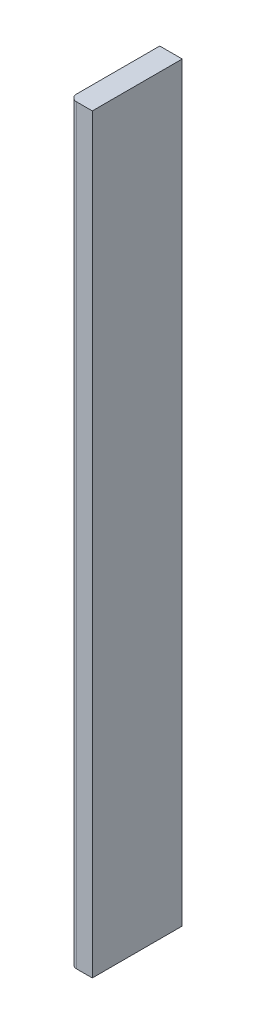
ISO-10303-21;
HEADER;
FILE_DESCRIPTION(('STEP AP214'),'2;1');
FILE_NAME('part.step','',(''),(''),'','','');
FILE_SCHEMA(('AUTOMOTIVE_DESIGN { 1 0 10303 214 1 1 1 1 }'));
ENDSEC;
DATA;
#1=APPLICATION_CONTEXT('core data for automotive mechanical design processes');
#2=APPLICATION_PROTOCOL_DEFINITION('international standard','automotive_design',2000,#1);
#3=PRODUCT_CONTEXT('',#1,'mechanical');
#4=PRODUCT('Part','Part','',(#3));
#5=PRODUCT_RELATED_PRODUCT_CATEGORY('part','',(#4));
#6=PRODUCT_DEFINITION_FORMATION('','',#4);
#7=PRODUCT_DEFINITION_CONTEXT('part definition',#1,'design');
#8=PRODUCT_DEFINITION('design','',#6,#7);
#9=PRODUCT_DEFINITION_SHAPE('','',#8);
#10=(LENGTH_UNIT() NAMED_UNIT(*) SI_UNIT(.MILLI.,.METRE.));
#11=(NAMED_UNIT(*) PLANE_ANGLE_UNIT() SI_UNIT($,.RADIAN.));
#12=(NAMED_UNIT(*) SI_UNIT($,.STERADIAN.) SOLID_ANGLE_UNIT());
#13=UNCERTAINTY_MEASURE_WITH_UNIT(LENGTH_MEASURE(1.E-05),#10,'distance_accuracy_value','');
#14=(GEOMETRIC_REPRESENTATION_CONTEXT(3) GLOBAL_UNCERTAINTY_ASSIGNED_CONTEXT((#13)) GLOBAL_UNIT_ASSIGNED_CONTEXT((#10,
#11,#12)) REPRESENTATION_CONTEXT('',''));
#15=CARTESIAN_POINT('',(0.,0.,0.));
#16=DIRECTION('',(0.,0.,1.));
#17=DIRECTION('',(1.,0.,0.));
#18=AXIS2_PLACEMENT_3D('',#15,#16,#17);
#19=CARTESIAN_POINT('',(-1.1,16.7,4.));
#20=DIRECTION('',(0.,0.,-1.));
#21=DIRECTION('',(-1.,0.,0.));
#22=AXIS2_PLACEMENT_3D('',#19,#20,#21);
#23=PLANE('',#22);
#24=DIRECTION('',(1.,0.,0.));
#25=VECTOR('',#24,1.);
#26=CARTESIAN_POINT('',(-1.1,16.7,4.));
#27=LINE('',#26,#25);
#28=CARTESIAN_POINT('',(-0.800000000000001,16.7,4.));
#29=VERTEX_POINT('',#28);
#30=CARTESIAN_POINT('',(-0.1,16.7,4.));
#31=VERTEX_POINT('',#30);
#32=EDGE_CURVE('E97',#29,#31,#27,.T.);
#33=ORIENTED_EDGE('',*,*,#32,.F.);
#34=DIRECTION('',(0.,1.,0.));
#35=VECTOR('',#34,1.);
#36=CARTESIAN_POINT('',(-0.800000000000001,16.7,4.));
#37=LINE('',#36,#35);
#38=CARTESIAN_POINT('',(-0.800000000000001,-16.7,4.));
#39=VERTEX_POINT('',#38);
#40=EDGE_CURVE('E43',#29,#39,#37,.F.);
#41=ORIENTED_EDGE('',*,*,#40,.T.);
#42=DIRECTION('',(1.,0.,0.));
#43=VECTOR('',#42,1.);
#44=CARTESIAN_POINT('',(-1.1,-16.7,4.));
#45=LINE('',#44,#43);
#46=CARTESIAN_POINT('',(-0.1,-16.7,4.));
#47=VERTEX_POINT('',#46);
#48=EDGE_CURVE('E105',#39,#47,#45,.T.);
#49=ORIENTED_EDGE('',*,*,#48,.T.);
#50=DIRECTION('',(0.,1.,0.));
#51=VECTOR('',#50,1.);
#52=CARTESIAN_POINT('',(-0.1,16.7,4.));
#53=LINE('',#52,#51);
#54=EDGE_CURVE('E108',#47,#31,#53,.T.);
#55=ORIENTED_EDGE('',*,*,#54,.T.);
#56=EDGE_LOOP('',(#33,#41,#49,#55));
#57=FACE_BOUND('',#56,.T.);
#58=ADVANCED_FACE('F35',(#57),#23,.F.);
#59=CARTESIAN_POINT('',(-1.1,16.7,0.));
#60=DIRECTION('',(0.,-1.,0.));
#61=DIRECTION('',(0.,0.,-1.));
#62=AXIS2_PLACEMENT_3D('',#59,#60,#61);
#63=PLANE('',#62);
#64=DIRECTION('',(0.,0.,-1.));
#65=VECTOR('',#64,1.);
#66=CARTESIAN_POINT('',(-1.1,16.7,0.));
#67=LINE('',#66,#65);
#68=CARTESIAN_POINT('',(-1.1,16.7,3.7));
#69=VERTEX_POINT('',#68);
#70=CARTESIAN_POINT('',(-1.1,16.7,0.));
#71=VERTEX_POINT('',#70);
#72=EDGE_CURVE('E79',#69,#71,#67,.T.);
#73=ORIENTED_EDGE('',*,*,#72,.F.);
#74=CARTESIAN_POINT('',(-0.800000000000001,16.7,3.7));
#75=DIRECTION('',(0.,-1.,0.));
#76=DIRECTION('',(0.,0.,-1.));
#77=AXIS2_PLACEMENT_3D('',#74,#75,#76);
#78=CIRCLE('',#77,0.3);
#79=EDGE_CURVE('E57',#69,#29,#78,.F.);
#80=ORIENTED_EDGE('',*,*,#79,.T.);
#81=ORIENTED_EDGE('',*,*,#32,.T.);
#82=DIRECTION('',(0.,0.,-1.));
#83=VECTOR('',#82,1.);
#84=CARTESIAN_POINT('',(-0.1,16.7,0.));
#85=LINE('',#84,#83);
#86=CARTESIAN_POINT('',(-0.1,16.7,0.));
#87=VERTEX_POINT('',#86);
#88=EDGE_CURVE('E94',#31,#87,#85,.T.);
#89=ORIENTED_EDGE('',*,*,#88,.T.);
#90=DIRECTION('',(1.,0.,0.));
#91=VECTOR('',#90,1.);
#92=CARTESIAN_POINT('',(-1.1,16.7,0.));
#93=LINE('',#92,#91);
#94=EDGE_CURVE('E91',#71,#87,#93,.T.);
#95=ORIENTED_EDGE('',*,*,#94,.F.);
#96=EDGE_LOOP('',(#73,#80,#81,#89,#95));
#97=FACE_BOUND('',#96,.T.);
#98=ADVANCED_FACE('F92',(#97),#63,.F.);
#99=CARTESIAN_POINT('',(-1.1,-16.7,0.));
#100=DIRECTION('',(0.,0.,1.));
#101=DIRECTION('',(1.,0.,0.));
#102=AXIS2_PLACEMENT_3D('',#99,#100,#101);
#103=PLANE('',#102);
#104=DIRECTION('',(0.,-1.,0.));
#105=VECTOR('',#104,1.);
#106=CARTESIAN_POINT('',(-0.1,-16.7,0.));
#107=LINE('',#106,#105);
#108=CARTESIAN_POINT('',(-0.1,-16.7,0.));
#109=VERTEX_POINT('',#108);
#110=EDGE_CURVE('E112',#87,#109,#107,.T.);
#111=ORIENTED_EDGE('',*,*,#110,.T.);
#112=DIRECTION('',(1.,0.,0.));
#113=VECTOR('',#112,1.);
#114=CARTESIAN_POINT('',(-1.1,-16.7,0.));
#115=LINE('',#114,#113);
#116=CARTESIAN_POINT('',(-1.1,-16.7,0.));
#117=VERTEX_POINT('',#116);
#118=EDGE_CURVE('E98',#117,#109,#115,.T.);
#119=ORIENTED_EDGE('',*,*,#118,.F.);
#120=DIRECTION('',(0.,-1.,0.));
#121=VECTOR('',#120,1.);
#122=CARTESIAN_POINT('',(-1.1,-16.7,0.));
#123=LINE('',#122,#121);
#124=EDGE_CURVE('E84',#71,#117,#123,.T.);
#125=ORIENTED_EDGE('',*,*,#124,.F.);
#126=ORIENTED_EDGE('',*,*,#94,.T.);
#127=EDGE_LOOP('',(#111,#119,#125,#126));
#128=FACE_BOUND('',#127,.T.);
#129=ADVANCED_FACE('F100',(#128),#103,.F.);
#130=CARTESIAN_POINT('',(-1.1,-16.7,4.));
#131=DIRECTION('',(0.,1.,0.));
#132=DIRECTION('',(0.,0.,1.));
#133=AXIS2_PLACEMENT_3D('',#130,#131,#132);
#134=PLANE('',#133);
#135=ORIENTED_EDGE('',*,*,#48,.F.);
#136=CARTESIAN_POINT('',(-0.800000000000001,-16.7,3.7));
#137=DIRECTION('',(0.,1.,0.));
#138=DIRECTION('',(0.,0.,1.));
#139=AXIS2_PLACEMENT_3D('',#136,#137,#138);
#140=CIRCLE('',#139,0.3);
#141=CARTESIAN_POINT('',(-1.1,-16.7,3.7));
#142=VERTEX_POINT('',#141);
#143=EDGE_CURVE('E11',#39,#142,#140,.F.);
#144=ORIENTED_EDGE('',*,*,#143,.T.);
#145=DIRECTION('',(0.,0.,1.));
#146=VECTOR('',#145,1.);
#147=CARTESIAN_POINT('',(-1.1,-16.7,4.));
#148=LINE('',#147,#146);
#149=EDGE_CURVE('E103',#117,#142,#148,.T.);
#150=ORIENTED_EDGE('',*,*,#149,.F.);
#151=ORIENTED_EDGE('',*,*,#118,.T.);
#152=DIRECTION('',(0.,0.,1.));
#153=VECTOR('',#152,1.);
#154=CARTESIAN_POINT('',(-0.1,-16.7,4.));
#155=LINE('',#154,#153);
#156=EDGE_CURVE('E88',#109,#47,#155,.T.);
#157=ORIENTED_EDGE('',*,*,#156,.T.);
#158=EDGE_LOOP('',(#135,#144,#150,#151,#157));
#159=FACE_BOUND('',#158,.T.);
#160=ADVANCED_FACE('F126',(#159),#134,.F.);
#161=CARTESIAN_POINT('',(-1.1,0.,0.));
#162=DIRECTION('',(1.,0.,0.));
#163=DIRECTION('',(0.,0.,-1.));
#164=AXIS2_PLACEMENT_3D('',#161,#162,#163);
#165=PLANE('',#164);
#166=ORIENTED_EDGE('',*,*,#149,.T.);
#167=DIRECTION('',(0.,1.,0.));
#168=VECTOR('',#167,1.);
#169=CARTESIAN_POINT('',(-1.1,0.,3.7));
#170=LINE('',#169,#168);
#171=EDGE_CURVE('E87',#142,#69,#170,.T.);
#172=ORIENTED_EDGE('',*,*,#171,.T.);
#173=ORIENTED_EDGE('',*,*,#72,.T.);
#174=ORIENTED_EDGE('',*,*,#124,.T.);
#175=EDGE_LOOP('',(#166,#172,#173,#174));
#176=FACE_BOUND('',#175,.T.);
#177=ADVANCED_FACE('F82',(#176),#165,.F.);
#178=CARTESIAN_POINT('',(-0.1,0.,0.));
#179=DIRECTION('',(1.,0.,0.));
#180=DIRECTION('',(0.,0.,-1.));
#181=AXIS2_PLACEMENT_3D('',#178,#179,#180);
#182=PLANE('',#181);
#183=ORIENTED_EDGE('',*,*,#54,.F.);
#184=ORIENTED_EDGE('',*,*,#156,.F.);
#185=ORIENTED_EDGE('',*,*,#110,.F.);
#186=ORIENTED_EDGE('',*,*,#88,.F.);
#187=EDGE_LOOP('',(#183,#184,#185,#186));
#188=FACE_BOUND('',#187,.T.);
#189=ADVANCED_FACE('F122',(#188),#182,.T.);
#190=CARTESIAN_POINT('',(-0.800000000000001,0.,3.7));
#191=DIRECTION('',(0.,1.,0.));
#192=DIRECTION('',(0.,0.,1.));
#193=AXIS2_PLACEMENT_3D('',#190,#191,#192);
#194=CYLINDRICAL_SURFACE('',#193,0.3);
#195=ORIENTED_EDGE('',*,*,#143,.F.);
#196=ORIENTED_EDGE('',*,*,#40,.F.);
#197=ORIENTED_EDGE('',*,*,#79,.F.);
#198=ORIENTED_EDGE('',*,*,#171,.F.);
#199=EDGE_LOOP('',(#195,#196,#197,#198));
#200=FACE_BOUND('',#199,.T.);
#201=ADVANCED_FACE('F37',(#200),#194,.T.);
#202=CLOSED_SHELL('',(#58,#98,#129,#160,#177,#189,#201));
#203=MANIFOLD_SOLID_BREP('B2',#202);
#204=ADVANCED_BREP_SHAPE_REPRESENTATION('',(#18,#203),#14);
#205=SHAPE_DEFINITION_REPRESENTATION(#9,#204);
ENDSEC;
END-ISO-10303-21;
